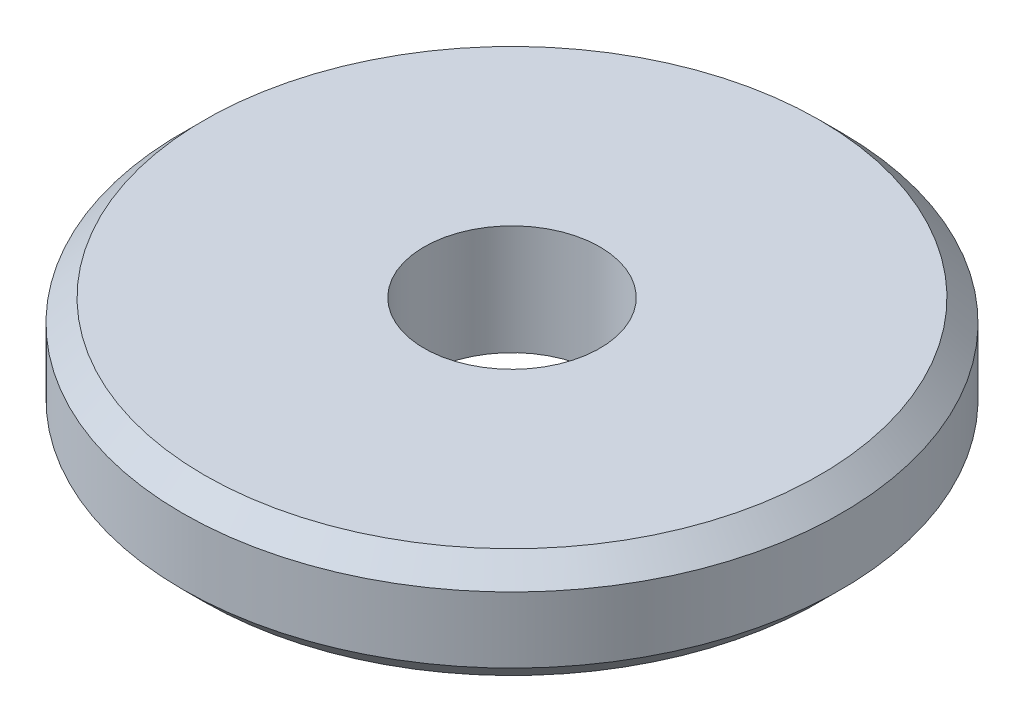
ISO-10303-21;
HEADER;
FILE_DESCRIPTION(('STEP AP214'),'2;1');
FILE_NAME('part.step','',(''),(''),'','','');
FILE_SCHEMA(('AUTOMOTIVE_DESIGN { 1 0 10303 214 1 1 1 1 }'));
ENDSEC;
DATA;
#1=APPLICATION_CONTEXT('core data for automotive mechanical design processes');
#2=APPLICATION_PROTOCOL_DEFINITION('international standard','automotive_design',2000,#1);
#3=PRODUCT_CONTEXT('',#1,'mechanical');
#4=PRODUCT('Part','Part','',(#3));
#5=PRODUCT_RELATED_PRODUCT_CATEGORY('part','',(#4));
#6=PRODUCT_DEFINITION_FORMATION('','',#4);
#7=PRODUCT_DEFINITION_CONTEXT('part definition',#1,'design');
#8=PRODUCT_DEFINITION('design','',#6,#7);
#9=PRODUCT_DEFINITION_SHAPE('','',#8);
#10=(LENGTH_UNIT() NAMED_UNIT(*) SI_UNIT(.MILLI.,.METRE.));
#11=(NAMED_UNIT(*) PLANE_ANGLE_UNIT() SI_UNIT($,.RADIAN.));
#12=(NAMED_UNIT(*) SI_UNIT($,.STERADIAN.) SOLID_ANGLE_UNIT());
#13=UNCERTAINTY_MEASURE_WITH_UNIT(LENGTH_MEASURE(1.E-05),#10,'distance_accuracy_value','');
#14=(GEOMETRIC_REPRESENTATION_CONTEXT(3) GLOBAL_UNCERTAINTY_ASSIGNED_CONTEXT((#13)) GLOBAL_UNIT_ASSIGNED_CONTEXT((#10,
#11,#12)) REPRESENTATION_CONTEXT('',''));
#15=CARTESIAN_POINT('',(0.,0.,0.));
#16=DIRECTION('',(0.,0.,1.));
#17=DIRECTION('',(1.,0.,0.));
#18=AXIS2_PLACEMENT_3D('',#15,#16,#17);
#19=CARTESIAN_POINT('',(0.,5.,0.));
#20=DIRECTION('',(0.,-1.,0.));
#21=DIRECTION('',(0.,0.,-1.));
#22=AXIS2_PLACEMENT_3D('',#19,#20,#21);
#23=CYLINDRICAL_SURFACE('',#22,15.);
#24=CARTESIAN_POINT('',(0.,0.999999999999996,0.));
#25=DIRECTION('',(0.,1.,0.));
#26=DIRECTION('',(0.,0.,1.));
#27=AXIS2_PLACEMENT_3D('',#24,#25,#26);
#28=CIRCLE('',#27,15.);
#29=CARTESIAN_POINT('',(0.,0.999999999999996,15.));
#30=VERTEX_POINT('',#29);
#31=EDGE_CURVE('E46',#30,#30,#28,.T.);
#32=ORIENTED_EDGE('',*,*,#31,.T.);
#33=EDGE_LOOP('',(#32));
#34=FACE_BOUND('',#33,.T.);
#35=CARTESIAN_POINT('',(0.,4.,0.));
#36=DIRECTION('',(0.,1.,0.));
#37=DIRECTION('',(0.,0.,1.));
#38=AXIS2_PLACEMENT_3D('',#35,#36,#37);
#39=CIRCLE('',#38,15.);
#40=CARTESIAN_POINT('',(0.,4.,15.));
#41=VERTEX_POINT('',#40);
#42=EDGE_CURVE('E50',#41,#41,#39,.F.);
#43=ORIENTED_EDGE('',*,*,#42,.T.);
#44=EDGE_LOOP('',(#43));
#45=FACE_BOUND('',#44,.T.);
#46=ADVANCED_FACE('F35',(#34,#45),#23,.T.);
#47=CARTESIAN_POINT('',(0.,5.,0.));
#48=DIRECTION('',(0.,1.,0.));
#49=DIRECTION('',(0.,0.,1.));
#50=AXIS2_PLACEMENT_3D('',#47,#48,#49);
#51=PLANE('',#50);
#52=CARTESIAN_POINT('',(0.,5.,0.));
#53=DIRECTION('',(0.,-1.,0.));
#54=DIRECTION('',(0.,0.,-1.));
#55=AXIS2_PLACEMENT_3D('',#52,#53,#54);
#56=CIRCLE('',#55,4.);
#57=CARTESIAN_POINT('',(0.,5.,-4.));
#58=VERTEX_POINT('',#57);
#59=EDGE_CURVE('E55',#58,#58,#56,.T.);
#60=ORIENTED_EDGE('',*,*,#59,.T.);
#61=EDGE_LOOP('',(#60));
#62=FACE_BOUND('',#61,.T.);
#63=CARTESIAN_POINT('',(0.,5.,0.));
#64=DIRECTION('',(0.,1.,0.));
#65=DIRECTION('',(0.,0.,1.));
#66=AXIS2_PLACEMENT_3D('',#63,#64,#65);
#67=CIRCLE('',#66,14.);
#68=CARTESIAN_POINT('',(0.,5.,14.));
#69=VERTEX_POINT('',#68);
#70=EDGE_CURVE('E10',#69,#69,#67,.T.);
#71=ORIENTED_EDGE('',*,*,#70,.T.);
#72=EDGE_LOOP('',(#71));
#73=FACE_BOUND('',#72,.T.);
#74=ADVANCED_FACE('F62',(#62,#73),#51,.T.);
#75=CARTESIAN_POINT('',(0.,0.,0.));
#76=DIRECTION('',(0.,1.,0.));
#77=DIRECTION('',(0.,0.,1.));
#78=AXIS2_PLACEMENT_3D('',#75,#76,#77);
#79=PLANE('',#78);
#80=CARTESIAN_POINT('',(0.,0.,0.));
#81=DIRECTION('',(0.,-1.,0.));
#82=DIRECTION('',(0.,0.,-1.));
#83=AXIS2_PLACEMENT_3D('',#80,#81,#82);
#84=CIRCLE('',#83,4.);
#85=CARTESIAN_POINT('',(0.,0.,-4.));
#86=VERTEX_POINT('',#85);
#87=EDGE_CURVE('E56',#86,#86,#84,.T.);
#88=ORIENTED_EDGE('',*,*,#87,.F.);
#89=EDGE_LOOP('',(#88));
#90=FACE_BOUND('',#89,.T.);
#91=CARTESIAN_POINT('',(0.,0.,0.));
#92=DIRECTION('',(0.,1.,0.));
#93=DIRECTION('',(0.,0.,1.));
#94=AXIS2_PLACEMENT_3D('',#91,#92,#93);
#95=CIRCLE('',#94,14.);
#96=CARTESIAN_POINT('',(0.,0.,14.));
#97=VERTEX_POINT('',#96);
#98=EDGE_CURVE('E42',#97,#97,#95,.F.);
#99=ORIENTED_EDGE('',*,*,#98,.T.);
#100=EDGE_LOOP('',(#99));
#101=FACE_BOUND('',#100,.T.);
#102=ADVANCED_FACE('F70',(#90,#101),#79,.F.);
#103=CARTESIAN_POINT('',(0.,0.999999999999996,0.));
#104=DIRECTION('',(0.,1.,0.));
#105=DIRECTION('',(0.,0.,1.));
#106=AXIS2_PLACEMENT_3D('',#103,#104,#105);
#107=CONICAL_SURFACE('',#106,15.,0.78539816339745);
#108=ORIENTED_EDGE('',*,*,#98,.F.);
#109=EDGE_LOOP('',(#108));
#110=FACE_BOUND('',#109,.T.);
#111=ORIENTED_EDGE('',*,*,#31,.F.);
#112=EDGE_LOOP('',(#111));
#113=FACE_BOUND('',#112,.T.);
#114=ADVANCED_FACE('F72',(#110,#113),#107,.T.);
#115=CARTESIAN_POINT('',(0.,5.,0.));
#116=DIRECTION('',(0.,-1.,0.));
#117=DIRECTION('',(0.,0.,-1.));
#118=AXIS2_PLACEMENT_3D('',#115,#116,#117);
#119=CONICAL_SURFACE('',#118,14.,0.785398163397446);
#120=ORIENTED_EDGE('',*,*,#42,.F.);
#121=EDGE_LOOP('',(#120));
#122=FACE_BOUND('',#121,.T.);
#123=ORIENTED_EDGE('',*,*,#70,.F.);
#124=EDGE_LOOP('',(#123));
#125=FACE_BOUND('',#124,.T.);
#126=ADVANCED_FACE('F37',(#122,#125),#119,.T.);
#127=CARTESIAN_POINT('',(0.,5.,0.));
#128=DIRECTION('',(0.,-1.,0.));
#129=DIRECTION('',(0.,0.,-1.));
#130=AXIS2_PLACEMENT_3D('',#127,#128,#129);
#131=CYLINDRICAL_SURFACE('',#130,4.);
#132=ORIENTED_EDGE('',*,*,#59,.F.);
#133=EDGE_LOOP('',(#132));
#134=FACE_BOUND('',#133,.T.);
#135=ORIENTED_EDGE('',*,*,#87,.T.);
#136=EDGE_LOOP('',(#135));
#137=FACE_BOUND('',#136,.T.);
#138=ADVANCED_FACE('F64',(#134,#137),#131,.F.);
#139=CLOSED_SHELL('',(#46,#74,#102,#114,#126,#138));
#140=MANIFOLD_SOLID_BREP('B2',#139);
#141=ADVANCED_BREP_SHAPE_REPRESENTATION('',(#18,#140),#14);
#142=SHAPE_DEFINITION_REPRESENTATION(#9,#141);
ENDSEC;
END-ISO-10303-21;
